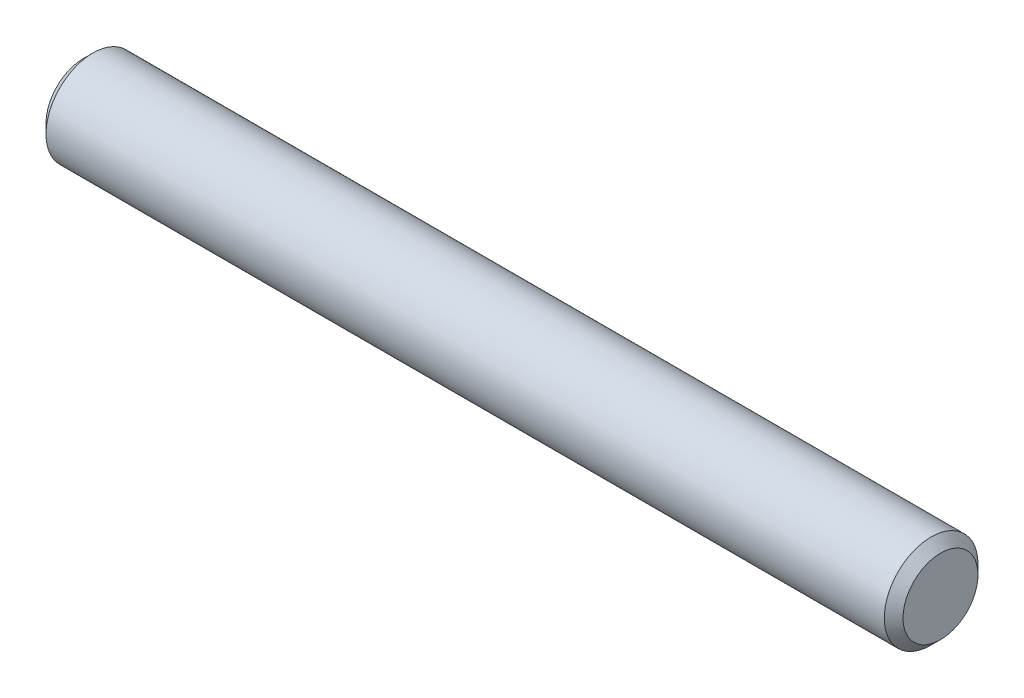
ISO-10303-21;
HEADER;
FILE_DESCRIPTION(('STEP AP214'),'2;1');
FILE_NAME('part.step','',(''),(''),'','','');
FILE_SCHEMA(('AUTOMOTIVE_DESIGN { 1 0 10303 214 1 1 1 1 }'));
ENDSEC;
DATA;
#1=APPLICATION_CONTEXT('core data for automotive mechanical design processes');
#2=APPLICATION_PROTOCOL_DEFINITION('international standard','automotive_design',2000,#1);
#3=PRODUCT_CONTEXT('',#1,'mechanical');
#4=PRODUCT('Part','Part','',(#3));
#5=PRODUCT_RELATED_PRODUCT_CATEGORY('part','',(#4));
#6=PRODUCT_DEFINITION_FORMATION('','',#4);
#7=PRODUCT_DEFINITION_CONTEXT('part definition',#1,'design');
#8=PRODUCT_DEFINITION('design','',#6,#7);
#9=PRODUCT_DEFINITION_SHAPE('','',#8);
#10=(LENGTH_UNIT() NAMED_UNIT(*) SI_UNIT(.MILLI.,.METRE.));
#11=(NAMED_UNIT(*) PLANE_ANGLE_UNIT() SI_UNIT($,.RADIAN.));
#12=(NAMED_UNIT(*) SI_UNIT($,.STERADIAN.) SOLID_ANGLE_UNIT());
#13=UNCERTAINTY_MEASURE_WITH_UNIT(LENGTH_MEASURE(1.E-05),#10,'distance_accuracy_value','');
#14=(GEOMETRIC_REPRESENTATION_CONTEXT(3) GLOBAL_UNCERTAINTY_ASSIGNED_CONTEXT((#13)) GLOBAL_UNIT_ASSIGNED_CONTEXT((#10,
#11,#12)) REPRESENTATION_CONTEXT('',''));
#15=CARTESIAN_POINT('',(0.,0.,0.));
#16=DIRECTION('',(0.,0.,1.));
#17=DIRECTION('',(1.,0.,0.));
#18=AXIS2_PLACEMENT_3D('',#15,#16,#17);
#19=CARTESIAN_POINT('',(-12.7,0.,0.));
#20=DIRECTION('',(1.,0.,0.));
#21=DIRECTION('',(0.,0.,-1.));
#22=AXIS2_PLACEMENT_3D('',#19,#20,#21);
#23=CYLINDRICAL_SURFACE('',#22,1.3890625);
#24=CARTESIAN_POINT('',(12.4221875,0.,0.));
#25=DIRECTION('',(1.,0.,0.));
#26=DIRECTION('',(0.,0.,-1.));
#27=AXIS2_PLACEMENT_3D('',#24,#25,#26);
#28=CIRCLE('',#27,1.3890625);
#29=CARTESIAN_POINT('',(12.4221875,0.,-1.3890625));
#30=VERTEX_POINT('',#29);
#31=EDGE_CURVE('E37',#30,#30,#28,.F.);
#32=ORIENTED_EDGE('',*,*,#31,.T.);
#33=EDGE_LOOP('',(#32));
#34=FACE_BOUND('',#33,.T.);
#35=CARTESIAN_POINT('',(-12.4221875,0.,0.));
#36=DIRECTION('',(1.,0.,0.));
#37=DIRECTION('',(0.,0.,-1.));
#38=AXIS2_PLACEMENT_3D('',#35,#36,#37);
#39=CIRCLE('',#38,1.3890625);
#40=CARTESIAN_POINT('',(-12.4221875,0.,-1.3890625));
#41=VERTEX_POINT('',#40);
#42=EDGE_CURVE('E41',#41,#41,#39,.T.);
#43=ORIENTED_EDGE('',*,*,#42,.T.);
#44=EDGE_LOOP('',(#43));
#45=FACE_BOUND('',#44,.T.);
#46=ADVANCED_FACE('F30',(#34,#45),#23,.T.);
#47=CARTESIAN_POINT('',(-12.7,0.,0.));
#48=DIRECTION('',(1.,0.,0.));
#49=DIRECTION('',(0.,0.,-1.));
#50=AXIS2_PLACEMENT_3D('',#47,#48,#49);
#51=PLANE('',#50);
#52=CARTESIAN_POINT('',(-12.7,0.,0.));
#53=DIRECTION('',(1.,0.,0.));
#54=DIRECTION('',(0.,0.,-1.));
#55=AXIS2_PLACEMENT_3D('',#52,#53,#54);
#56=CIRCLE('',#55,1.11125);
#57=CARTESIAN_POINT('',(-12.7,0.,-1.11125));
#58=VERTEX_POINT('',#57);
#59=EDGE_CURVE('E10',#58,#58,#56,.F.);
#60=ORIENTED_EDGE('',*,*,#59,.T.);
#61=EDGE_LOOP('',(#60));
#62=FACE_BOUND('',#61,.T.);
#63=ADVANCED_FACE('F61',(#62),#51,.F.);
#64=CARTESIAN_POINT('',(12.7,0.,0.));
#65=DIRECTION('',(1.,0.,0.));
#66=DIRECTION('',(0.,0.,-1.));
#67=AXIS2_PLACEMENT_3D('',#64,#65,#66);
#68=PLANE('',#67);
#69=CARTESIAN_POINT('',(12.7,0.,0.));
#70=DIRECTION('',(1.,0.,0.));
#71=DIRECTION('',(0.,0.,-1.));
#72=AXIS2_PLACEMENT_3D('',#69,#70,#71);
#73=CIRCLE('',#72,1.11124999999999);
#74=CARTESIAN_POINT('',(12.7,0.,-1.11124999999999));
#75=VERTEX_POINT('',#74);
#76=EDGE_CURVE('E45',#75,#75,#73,.T.);
#77=ORIENTED_EDGE('',*,*,#76,.T.);
#78=EDGE_LOOP('',(#77));
#79=FACE_BOUND('',#78,.T.);
#80=ADVANCED_FACE('F51',(#79),#68,.T.);
#81=CARTESIAN_POINT('',(12.7,0.,0.));
#82=DIRECTION('',(-1.,0.,0.));
#83=DIRECTION('',(0.,0.,1.));
#84=AXIS2_PLACEMENT_3D('',#81,#82,#83);
#85=CONICAL_SURFACE('',#84,1.11124999999999,0.785398163397454);
#86=ORIENTED_EDGE('',*,*,#31,.F.);
#87=EDGE_LOOP('',(#86));
#88=FACE_BOUND('',#87,.T.);
#89=ORIENTED_EDGE('',*,*,#76,.F.);
#90=EDGE_LOOP('',(#89));
#91=FACE_BOUND('',#90,.T.);
#92=ADVANCED_FACE('F53',(#88,#91),#85,.T.);
#93=CARTESIAN_POINT('',(-12.4221875,0.,0.));
#94=DIRECTION('',(1.,0.,0.));
#95=DIRECTION('',(0.,0.,-1.));
#96=AXIS2_PLACEMENT_3D('',#93,#94,#95);
#97=CONICAL_SURFACE('',#96,1.3890625,0.785398163397451);
#98=ORIENTED_EDGE('',*,*,#59,.F.);
#99=EDGE_LOOP('',(#98));
#100=FACE_BOUND('',#99,.T.);
#101=ORIENTED_EDGE('',*,*,#42,.F.);
#102=EDGE_LOOP('',(#101));
#103=FACE_BOUND('',#102,.T.);
#104=ADVANCED_FACE('F32',(#100,#103),#97,.T.);
#105=CLOSED_SHELL('',(#46,#63,#80,#92,#104));
#106=MANIFOLD_SOLID_BREP('B2',#105);
#107=ADVANCED_BREP_SHAPE_REPRESENTATION('',(#18,#106),#14);
#108=SHAPE_DEFINITION_REPRESENTATION(#9,#107);
ENDSEC;
END-ISO-10303-21;
